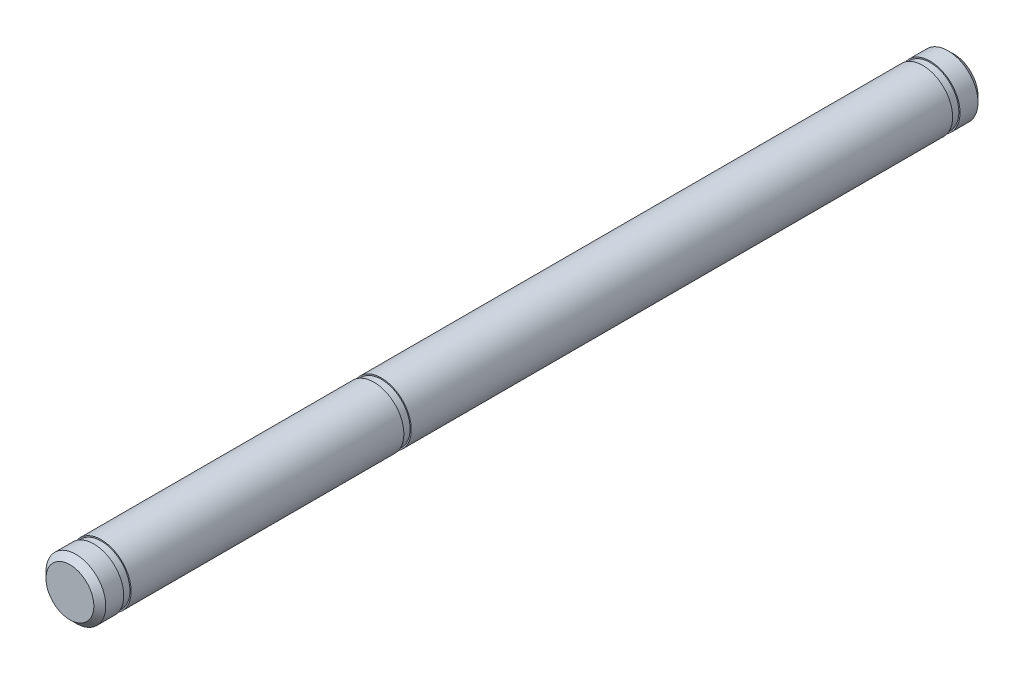
ISO-10303-21;
HEADER;
FILE_DESCRIPTION(('STEP AP214'),'2;1');
FILE_NAME('part.step','',(''),(''),'','','');
FILE_SCHEMA(('AUTOMOTIVE_DESIGN { 1 0 10303 214 1 1 1 1 }'));
ENDSEC;
DATA;
#1=APPLICATION_CONTEXT('core data for automotive mechanical design processes');
#2=APPLICATION_PROTOCOL_DEFINITION('international standard','automotive_design',2000,#1);
#3=PRODUCT_CONTEXT('',#1,'mechanical');
#4=PRODUCT('Part','Part','',(#3));
#5=PRODUCT_RELATED_PRODUCT_CATEGORY('part','',(#4));
#6=PRODUCT_DEFINITION_FORMATION('','',#4);
#7=PRODUCT_DEFINITION_CONTEXT('part definition',#1,'design');
#8=PRODUCT_DEFINITION('design','',#6,#7);
#9=PRODUCT_DEFINITION_SHAPE('','',#8);
#10=(LENGTH_UNIT() NAMED_UNIT(*) SI_UNIT(.MILLI.,.METRE.));
#11=(NAMED_UNIT(*) PLANE_ANGLE_UNIT() SI_UNIT($,.RADIAN.));
#12=(NAMED_UNIT(*) SI_UNIT($,.STERADIAN.) SOLID_ANGLE_UNIT());
#13=UNCERTAINTY_MEASURE_WITH_UNIT(LENGTH_MEASURE(1.E-05),#10,'distance_accuracy_value','');
#14=(GEOMETRIC_REPRESENTATION_CONTEXT(3) GLOBAL_UNCERTAINTY_ASSIGNED_CONTEXT((#13)) GLOBAL_UNIT_ASSIGNED_CONTEXT((#10,
#11,#12)) REPRESENTATION_CONTEXT('',''));
#15=CARTESIAN_POINT('',(0.,0.,0.));
#16=DIRECTION('',(0.,0.,1.));
#17=DIRECTION('',(1.,0.,0.));
#18=AXIS2_PLACEMENT_3D('',#15,#16,#17);
#19=CARTESIAN_POINT('',(0.,0.,50.));
#20=DIRECTION('',(0.,0.,-1.));
#21=DIRECTION('',(-1.,0.,0.));
#22=AXIS2_PLACEMENT_3D('',#19,#20,#21);
#23=CYLINDRICAL_SURFACE('',#22,2.5);
#24=CARTESIAN_POINT('',(0.,0.,-35.9303518061237));
#25=DIRECTION('',(0.,0.,1.));
#26=DIRECTION('',(1.,0.,0.));
#27=AXIS2_PLACEMENT_3D('',#24,#25,#26);
#28=CIRCLE('',#27,2.5);
#29=CARTESIAN_POINT('',(2.5,0.,-35.9303518061237));
#30=VERTEX_POINT('',#29);
#31=EDGE_CURVE('E41',#30,#30,#28,.T.);
#32=ORIENTED_EDGE('',*,*,#31,.T.);
#33=EDGE_LOOP('',(#32));
#34=FACE_BOUND('',#33,.T.);
#35=CARTESIAN_POINT('',(0.,0.,-34.4303518061237));
#36=DIRECTION('',(0.,0.,-1.));
#37=DIRECTION('',(-1.,0.,0.));
#38=AXIS2_PLACEMENT_3D('',#35,#36,#37);
#39=CIRCLE('',#38,2.5);
#40=CARTESIAN_POINT('',(-2.5,0.,-34.4303518061237));
#41=VERTEX_POINT('',#40);
#42=EDGE_CURVE('E54',#41,#41,#39,.T.);
#43=ORIENTED_EDGE('',*,*,#42,.T.);
#44=EDGE_LOOP('',(#43));
#45=FACE_BOUND('',#44,.T.);
#46=ADVANCED_FACE('F33',(#34,#45),#23,.T.);
#47=CARTESIAN_POINT('',(0.,0.,-36.4303518061237));
#48=DIRECTION('',(0.,0.,1.));
#49=DIRECTION('',(1.,0.,0.));
#50=AXIS2_PLACEMENT_3D('',#47,#48,#49);
#51=PLANE('',#50);
#52=CARTESIAN_POINT('',(0.,0.,-36.4303518061237));
#53=DIRECTION('',(0.,0.,1.));
#54=DIRECTION('',(1.,0.,0.));
#55=AXIS2_PLACEMENT_3D('',#52,#53,#54);
#56=CIRCLE('',#55,2.);
#57=CARTESIAN_POINT('',(2.,0.,-36.4303518061237));
#58=VERTEX_POINT('',#57);
#59=EDGE_CURVE('E10',#58,#58,#56,.F.);
#60=ORIENTED_EDGE('',*,*,#59,.T.);
#61=EDGE_LOOP('',(#60));
#62=FACE_BOUND('',#61,.T.);
#63=ADVANCED_FACE('F104',(#62),#51,.F.);
#64=CARTESIAN_POINT('',(2.4,0.,-34.4303518061237));
#65=DIRECTION('',(0.,0.,-1.));
#66=DIRECTION('',(-1.,0.,0.));
#67=AXIS2_PLACEMENT_3D('',#64,#65,#66);
#68=PLANE('',#67);
#69=CARTESIAN_POINT('',(0.,0.,-34.4303518061237));
#70=DIRECTION('',(0.,0.,1.));
#71=DIRECTION('',(1.,0.,0.));
#72=AXIS2_PLACEMENT_3D('',#69,#70,#71);
#73=CIRCLE('',#72,2.4);
#74=CARTESIAN_POINT('',(2.4,0.,-34.4303518061237));
#75=VERTEX_POINT('',#74);
#76=EDGE_CURVE('E72',#75,#75,#73,.T.);
#77=ORIENTED_EDGE('',*,*,#76,.F.);
#78=EDGE_LOOP('',(#77));
#79=FACE_BOUND('',#78,.T.);
#80=ORIENTED_EDGE('',*,*,#42,.F.);
#81=EDGE_LOOP('',(#80));
#82=FACE_BOUND('',#81,.T.);
#83=ADVANCED_FACE('F101',(#79,#82),#68,.F.);
#84=CARTESIAN_POINT('',(2.4,0.,-33.8103518061237));
#85=DIRECTION('',(0.,0.,1.));
#86=DIRECTION('',(1.,0.,0.));
#87=AXIS2_PLACEMENT_3D('',#84,#85,#86);
#88=PLANE('',#87);
#89=CARTESIAN_POINT('',(0.,0.,-33.8103518061237));
#90=DIRECTION('',(0.,0.,1.));
#91=DIRECTION('',(1.,0.,0.));
#92=AXIS2_PLACEMENT_3D('',#89,#90,#91);
#93=CIRCLE('',#92,2.4);
#94=CARTESIAN_POINT('',(2.4,0.,-33.8103518061237));
#95=VERTEX_POINT('',#94);
#96=EDGE_CURVE('E83',#95,#95,#93,.T.);
#97=ORIENTED_EDGE('',*,*,#96,.T.);
#98=EDGE_LOOP('',(#97));
#99=FACE_BOUND('',#98,.T.);
#100=CARTESIAN_POINT('',(0.,0.,-33.8103518061237));
#101=DIRECTION('',(0.,0.,1.));
#102=DIRECTION('',(1.,0.,0.));
#103=AXIS2_PLACEMENT_3D('',#100,#101,#102);
#104=CIRCLE('',#103,2.5);
#105=CARTESIAN_POINT('',(2.5,0.,-33.8103518061237));
#106=VERTEX_POINT('',#105);
#107=EDGE_CURVE('E57',#106,#106,#104,.T.);
#108=ORIENTED_EDGE('',*,*,#107,.F.);
#109=EDGE_LOOP('',(#108));
#110=FACE_BOUND('',#109,.T.);
#111=ADVANCED_FACE('F91',(#99,#110),#88,.F.);
#112=CARTESIAN_POINT('',(0.,0.,50.));
#113=DIRECTION('',(0.,0.,1.));
#114=DIRECTION('',(1.,0.,0.));
#115=AXIS2_PLACEMENT_3D('',#112,#113,#114);
#116=CYLINDRICAL_SURFACE('',#115,2.4);
#117=ORIENTED_EDGE('',*,*,#96,.F.);
#118=EDGE_LOOP('',(#117));
#119=FACE_BOUND('',#118,.T.);
#120=ORIENTED_EDGE('',*,*,#76,.T.);
#121=EDGE_LOOP('',(#120));
#122=FACE_BOUND('',#121,.T.);
#123=ADVANCED_FACE('F94',(#119,#122),#116,.T.);
#124=ORIENTED_EDGE('',*,*,#107,.T.);
#125=EDGE_LOOP('',(#124));
#126=FACE_BOUND('',#125,.T.);
#127=CARTESIAN_POINT('',(0.,0.,11.458648193834));
#128=DIRECTION('',(0.,0.,-1.));
#129=DIRECTION('',(-1.,0.,0.));
#130=AXIS2_PLACEMENT_3D('',#127,#128,#129);
#131=CIRCLE('',#130,2.5);
#132=CARTESIAN_POINT('',(-2.5,0.,11.458648193834));
#133=VERTEX_POINT('',#132);
#134=EDGE_CURVE('E69',#133,#133,#131,.T.);
#135=ORIENTED_EDGE('',*,*,#134,.T.);
#136=EDGE_LOOP('',(#135));
#137=FACE_BOUND('',#136,.T.);
#138=ADVANCED_FACE('F97',(#126,#137),#23,.T.);
#139=CARTESIAN_POINT('',(2.4,0.,12.078648193834));
#140=DIRECTION('',(0.,0.,1.));
#141=DIRECTION('',(1.,0.,0.));
#142=AXIS2_PLACEMENT_3D('',#139,#140,#141);
#143=PLANE('',#142);
#144=CARTESIAN_POINT('',(0.,0.,12.078648193834));
#145=DIRECTION('',(0.,0.,1.));
#146=DIRECTION('',(1.,0.,0.));
#147=AXIS2_PLACEMENT_3D('',#144,#145,#146);
#148=CIRCLE('',#147,2.4);
#149=CARTESIAN_POINT('',(2.4,0.,12.078648193834));
#150=VERTEX_POINT('',#149);
#151=EDGE_CURVE('E73',#150,#150,#148,.T.);
#152=ORIENTED_EDGE('',*,*,#151,.T.);
#153=EDGE_LOOP('',(#152));
#154=FACE_BOUND('',#153,.T.);
#155=CARTESIAN_POINT('',(0.,0.,12.078648193834));
#156=DIRECTION('',(0.,0.,1.));
#157=DIRECTION('',(1.,0.,0.));
#158=AXIS2_PLACEMENT_3D('',#155,#156,#157);
#159=CIRCLE('',#158,2.5);
#160=CARTESIAN_POINT('',(2.5,0.,12.078648193834));
#161=VERTEX_POINT('',#160);
#162=EDGE_CURVE('E66',#161,#161,#159,.T.);
#163=ORIENTED_EDGE('',*,*,#162,.F.);
#164=EDGE_LOOP('',(#163));
#165=FACE_BOUND('',#164,.T.);
#166=ADVANCED_FACE('F122',(#154,#165),#143,.F.);
#167=CARTESIAN_POINT('',(2.4,0.,11.458648193834));
#168=DIRECTION('',(0.,0.,-1.));
#169=DIRECTION('',(-1.,0.,0.));
#170=AXIS2_PLACEMENT_3D('',#167,#168,#169);
#171=PLANE('',#170);
#172=CARTESIAN_POINT('',(0.,0.,11.458648193834));
#173=DIRECTION('',(0.,0.,1.));
#174=DIRECTION('',(1.,0.,0.));
#175=AXIS2_PLACEMENT_3D('',#172,#173,#174);
#176=CIRCLE('',#175,2.4);
#177=CARTESIAN_POINT('',(2.4,0.,11.458648193834));
#178=VERTEX_POINT('',#177);
#179=EDGE_CURVE('E77',#178,#178,#176,.T.);
#180=ORIENTED_EDGE('',*,*,#179,.F.);
#181=EDGE_LOOP('',(#180));
#182=FACE_BOUND('',#181,.T.);
#183=ORIENTED_EDGE('',*,*,#134,.F.);
#184=EDGE_LOOP('',(#183));
#185=FACE_BOUND('',#184,.T.);
#186=ADVANCED_FACE('F127',(#182,#185),#171,.F.);
#187=CARTESIAN_POINT('',(0.,0.,50.));
#188=DIRECTION('',(0.,0.,1.));
#189=DIRECTION('',(1.,0.,0.));
#190=AXIS2_PLACEMENT_3D('',#187,#188,#189);
#191=CYLINDRICAL_SURFACE('',#190,2.4);
#192=ORIENTED_EDGE('',*,*,#151,.F.);
#193=EDGE_LOOP('',(#192));
#194=FACE_BOUND('',#193,.T.);
#195=ORIENTED_EDGE('',*,*,#179,.T.);
#196=EDGE_LOOP('',(#195));
#197=FACE_BOUND('',#196,.T.);
#198=ADVANCED_FACE('F133',(#194,#197),#191,.T.);
#199=CARTESIAN_POINT('',(0.,0.,34.8836481938763));
#200=DIRECTION('',(0.,0.,-1.));
#201=DIRECTION('',(-1.,0.,0.));
#202=AXIS2_PLACEMENT_3D('',#199,#200,#201);
#203=CIRCLE('',#202,2.5);
#204=CARTESIAN_POINT('',(-2.5,0.,34.8836481938763));
#205=VERTEX_POINT('',#204);
#206=EDGE_CURVE('E63',#205,#205,#203,.T.);
#207=ORIENTED_EDGE('',*,*,#206,.T.);
#208=EDGE_LOOP('',(#207));
#209=FACE_BOUND('',#208,.T.);
#210=ORIENTED_EDGE('',*,*,#162,.T.);
#211=EDGE_LOOP('',(#210));
#212=FACE_BOUND('',#211,.T.);
#213=ADVANCED_FACE('F120',(#209,#212),#23,.T.);
#214=CARTESIAN_POINT('',(2.4,0.,35.5036481938763));
#215=DIRECTION('',(0.,0.,1.));
#216=DIRECTION('',(1.,0.,0.));
#217=AXIS2_PLACEMENT_3D('',#214,#215,#216);
#218=PLANE('',#217);
#219=CARTESIAN_POINT('',(0.,0.,35.5036481938763));
#220=DIRECTION('',(0.,0.,1.));
#221=DIRECTION('',(1.,0.,0.));
#222=AXIS2_PLACEMENT_3D('',#219,#220,#221);
#223=CIRCLE('',#222,2.4);
#224=CARTESIAN_POINT('',(2.4,0.,35.5036481938763));
#225=VERTEX_POINT('',#224);
#226=EDGE_CURVE('E80',#225,#225,#223,.T.);
#227=ORIENTED_EDGE('',*,*,#226,.T.);
#228=EDGE_LOOP('',(#227));
#229=FACE_BOUND('',#228,.T.);
#230=CARTESIAN_POINT('',(0.,0.,35.5036481938763));
#231=DIRECTION('',(0.,0.,1.));
#232=DIRECTION('',(1.,0.,0.));
#233=AXIS2_PLACEMENT_3D('',#230,#231,#232);
#234=CIRCLE('',#233,2.5);
#235=CARTESIAN_POINT('',(2.5,0.,35.5036481938763));
#236=VERTEX_POINT('',#235);
#237=EDGE_CURVE('E60',#236,#236,#234,.T.);
#238=ORIENTED_EDGE('',*,*,#237,.F.);
#239=EDGE_LOOP('',(#238));
#240=FACE_BOUND('',#239,.T.);
#241=ADVANCED_FACE('F132',(#229,#240),#218,.F.);
#242=CARTESIAN_POINT('',(2.4,0.,34.8836481938763));
#243=DIRECTION('',(0.,0.,-1.));
#244=DIRECTION('',(-1.,0.,0.));
#245=AXIS2_PLACEMENT_3D('',#242,#243,#244);
#246=PLANE('',#245);
#247=CARTESIAN_POINT('',(0.,0.,34.8836481938763));
#248=DIRECTION('',(0.,0.,1.));
#249=DIRECTION('',(1.,0.,0.));
#250=AXIS2_PLACEMENT_3D('',#247,#248,#249);
#251=CIRCLE('',#250,2.4);
#252=CARTESIAN_POINT('',(2.4,0.,34.8836481938763));
#253=VERTEX_POINT('',#252);
#254=EDGE_CURVE('E76',#253,#253,#251,.T.);
#255=ORIENTED_EDGE('',*,*,#254,.F.);
#256=EDGE_LOOP('',(#255));
#257=FACE_BOUND('',#256,.T.);
#258=ORIENTED_EDGE('',*,*,#206,.F.);
#259=EDGE_LOOP('',(#258));
#260=FACE_BOUND('',#259,.T.);
#261=ADVANCED_FACE('F139',(#257,#260),#246,.F.);
#262=CARTESIAN_POINT('',(0.,0.,50.));
#263=DIRECTION('',(0.,0.,1.));
#264=DIRECTION('',(1.,0.,0.));
#265=AXIS2_PLACEMENT_3D('',#262,#263,#264);
#266=CYLINDRICAL_SURFACE('',#265,2.4);
#267=ORIENTED_EDGE('',*,*,#226,.F.);
#268=EDGE_LOOP('',(#267));
#269=FACE_BOUND('',#268,.T.);
#270=ORIENTED_EDGE('',*,*,#254,.T.);
#271=EDGE_LOOP('',(#270));
#272=FACE_BOUND('',#271,.T.);
#273=ADVANCED_FACE('F118',(#269,#272),#266,.T.);
#274=CARTESIAN_POINT('',(0.,0.,37.0036481938763));
#275=DIRECTION('',(0.,0.,-1.));
#276=DIRECTION('',(-1.,0.,0.));
#277=AXIS2_PLACEMENT_3D('',#274,#275,#276);
#278=CIRCLE('',#277,2.5);
#279=CARTESIAN_POINT('',(-2.5,0.,37.0036481938763));
#280=VERTEX_POINT('',#279);
#281=EDGE_CURVE('E45',#280,#280,#278,.T.);
#282=ORIENTED_EDGE('',*,*,#281,.T.);
#283=EDGE_LOOP('',(#282));
#284=FACE_BOUND('',#283,.T.);
#285=ORIENTED_EDGE('',*,*,#237,.T.);
#286=EDGE_LOOP('',(#285));
#287=FACE_BOUND('',#286,.T.);
#288=ADVANCED_FACE('F110',(#284,#287),#23,.T.);
#289=CARTESIAN_POINT('',(0.,0.,37.5036481938763));
#290=DIRECTION('',(0.,0.,-1.));
#291=DIRECTION('',(-1.,0.,0.));
#292=AXIS2_PLACEMENT_3D('',#289,#290,#291);
#293=PLANE('',#292);
#294=CARTESIAN_POINT('',(0.,0.,37.5036481938763));
#295=DIRECTION('',(0.,0.,-1.));
#296=DIRECTION('',(-1.,0.,0.));
#297=AXIS2_PLACEMENT_3D('',#294,#295,#296);
#298=CIRCLE('',#297,2.00000000000001);
#299=CARTESIAN_POINT('',(-2.00000000000001,0.,37.5036481938763));
#300=VERTEX_POINT('',#299);
#301=EDGE_CURVE('E49',#300,#300,#298,.F.);
#302=ORIENTED_EDGE('',*,*,#301,.T.);
#303=EDGE_LOOP('',(#302));
#304=FACE_BOUND('',#303,.T.);
#305=ADVANCED_FACE('F117',(#304),#293,.F.);
#306=CARTESIAN_POINT('',(0.,0.,37.5036481938763));
#307=DIRECTION('',(0.,0.,-1.));
#308=DIRECTION('',(-1.,0.,0.));
#309=AXIS2_PLACEMENT_3D('',#306,#307,#308);
#310=CONICAL_SURFACE('',#309,2.00000000000001,0.785398163397446);
#311=ORIENTED_EDGE('',*,*,#281,.F.);
#312=EDGE_LOOP('',(#311));
#313=FACE_BOUND('',#312,.T.);
#314=ORIENTED_EDGE('',*,*,#301,.F.);
#315=EDGE_LOOP('',(#314));
#316=FACE_BOUND('',#315,.T.);
#317=ADVANCED_FACE('F219',(#313,#316),#310,.T.);
#318=CARTESIAN_POINT('',(0.,0.,-35.9303518061237));
#319=DIRECTION('',(0.,0.,1.));
#320=DIRECTION('',(1.,0.,0.));
#321=AXIS2_PLACEMENT_3D('',#318,#319,#320);
#322=CONICAL_SURFACE('',#321,2.5,0.785398163397446);
#323=ORIENTED_EDGE('',*,*,#59,.F.);
#324=EDGE_LOOP('',(#323));
#325=FACE_BOUND('',#324,.T.);
#326=ORIENTED_EDGE('',*,*,#31,.F.);
#327=EDGE_LOOP('',(#326));
#328=FACE_BOUND('',#327,.T.);
#329=ADVANCED_FACE('F36',(#325,#328),#322,.T.);
#330=CLOSED_SHELL('',(#46,#63,#83,#111,#123,#138,#166,#186,#198,#213,#241,#261,#273,#288,#305,
#317,#329));
#331=MANIFOLD_SOLID_BREP('B2',#330);
#332=ADVANCED_BREP_SHAPE_REPRESENTATION('',(#18,#331),#14);
#333=SHAPE_DEFINITION_REPRESENTATION(#9,#332);
ENDSEC;
END-ISO-10303-21;
